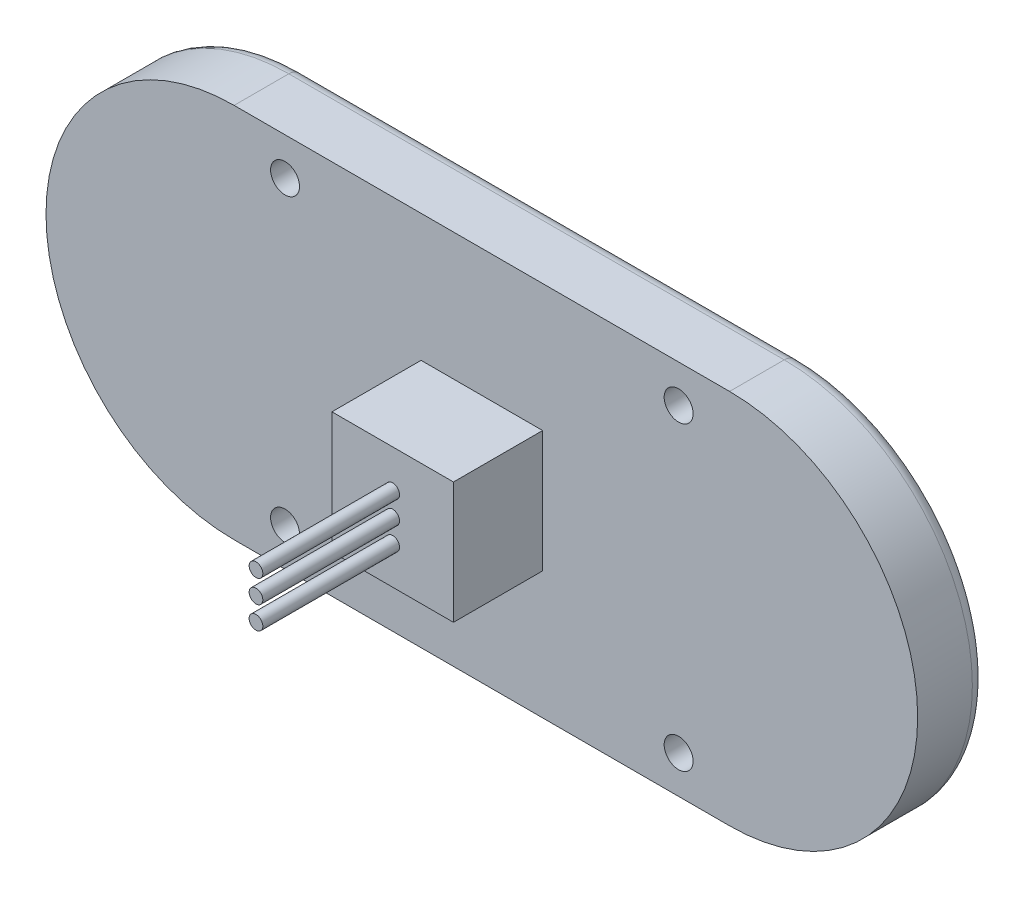
ISO-10303-21;
HEADER;
FILE_DESCRIPTION(('STEP AP214'),'2;1');
FILE_NAME('part.step','',(''),(''),'','','');
FILE_SCHEMA(('AUTOMOTIVE_DESIGN { 1 0 10303 214 1 1 1 1 }'));
ENDSEC;
DATA;
#1=APPLICATION_CONTEXT('core data for automotive mechanical design processes');
#2=APPLICATION_PROTOCOL_DEFINITION('international standard','automotive_design',2000,#1);
#3=PRODUCT_CONTEXT('',#1,'mechanical');
#4=PRODUCT('Part','Part','',(#3));
#5=PRODUCT_RELATED_PRODUCT_CATEGORY('part','',(#4));
#6=PRODUCT_DEFINITION_FORMATION('','',#4);
#7=PRODUCT_DEFINITION_CONTEXT('part definition',#1,'design');
#8=PRODUCT_DEFINITION('design','',#6,#7);
#9=PRODUCT_DEFINITION_SHAPE('','',#8);
#10=(LENGTH_UNIT() NAMED_UNIT(*) SI_UNIT(.MILLI.,.METRE.));
#11=(NAMED_UNIT(*) PLANE_ANGLE_UNIT() SI_UNIT($,.RADIAN.));
#12=(NAMED_UNIT(*) SI_UNIT($,.STERADIAN.) SOLID_ANGLE_UNIT());
#13=UNCERTAINTY_MEASURE_WITH_UNIT(LENGTH_MEASURE(1.E-05),#10,'distance_accuracy_value','');
#14=(GEOMETRIC_REPRESENTATION_CONTEXT(3) GLOBAL_UNCERTAINTY_ASSIGNED_CONTEXT((#13)) GLOBAL_UNIT_ASSIGNED_CONTEXT((#10,
#11,#12)) REPRESENTATION_CONTEXT('',''));
#15=CARTESIAN_POINT('',(0.,0.,0.));
#16=DIRECTION('',(0.,0.,1.));
#17=DIRECTION('',(1.,0.,0.));
#18=AXIS2_PLACEMENT_3D('',#15,#16,#17);
#19=CARTESIAN_POINT('',(54.3560000000004,-1.72171304990698E-13,-10.));
#20=DIRECTION('',(0.,0.,-1.));
#21=DIRECTION('',(-1.,0.,0.));
#22=AXIS2_PLACEMENT_3D('',#19,#20,#21);
#23=PLANE('',#22);
#24=DIRECTION('',(1.,0.,0.));
#25=VECTOR('',#24,1.);
#26=CARTESIAN_POINT('',(54.3560000000004,38.2749999999998,-10.));
#27=LINE('',#26,#25);
#28=CARTESIAN_POINT('',(-54.3559999999995,38.275,-10.));
#29=VERTEX_POINT('',#28);
#30=CARTESIAN_POINT('',(54.3560000000005,38.2749999999998,-10.));
#31=VERTEX_POINT('',#30);
#32=EDGE_CURVE('E278',#29,#31,#27,.T.);
#33=ORIENTED_EDGE('',*,*,#32,.T.);
#34=CARTESIAN_POINT('',(54.3560000000004,0.,-10.));
#35=DIRECTION('',(0.,0.,-1.));
#36=DIRECTION('',(-1.,0.,0.));
#37=AXIS2_PLACEMENT_3D('',#34,#35,#36);
#38=CIRCLE('',#37,38.275);
#39=CARTESIAN_POINT('',(54.3560000000004,-38.275,-10.));
#40=VERTEX_POINT('',#39);
#41=EDGE_CURVE('E291',#31,#40,#38,.T.);
#42=ORIENTED_EDGE('',*,*,#41,.T.);
#43=DIRECTION('',(-1.,0.,0.));
#44=VECTOR('',#43,1.);
#45=CARTESIAN_POINT('',(-54.3559999999996,-38.275,-10.));
#46=LINE('',#45,#44);
#47=CARTESIAN_POINT('',(-54.3559999999996,-38.275,-10.));
#48=VERTEX_POINT('',#47);
#49=EDGE_CURVE('E289',#40,#48,#46,.T.);
#50=ORIENTED_EDGE('',*,*,#49,.T.);
#51=CARTESIAN_POINT('',(-54.3559999999996,0.,-10.));
#52=DIRECTION('',(0.,0.,-1.));
#53=DIRECTION('',(-1.,0.,0.));
#54=AXIS2_PLACEMENT_3D('',#51,#52,#53);
#55=CIRCLE('',#54,38.275);
#56=EDGE_CURVE('E287',#48,#29,#55,.T.);
#57=ORIENTED_EDGE('',*,*,#56,.T.);
#58=EDGE_LOOP('',(#33,#42,#50,#57));
#59=FACE_BOUND('',#58,.T.);
#60=CARTESIAN_POINT('',(-43.18,-33.02,-10.));
#61=DIRECTION('',(0.,0.,-1.));
#62=DIRECTION('',(-1.,0.,0.));
#63=AXIS2_PLACEMENT_3D('',#60,#61,#62);
#64=CIRCLE('',#63,3.175);
#65=CARTESIAN_POINT('',(-46.355,-33.02,-10.));
#66=VERTEX_POINT('',#65);
#67=EDGE_CURVE('E183',#66,#66,#64,.T.);
#68=ORIENTED_EDGE('',*,*,#67,.F.);
#69=EDGE_LOOP('',(#68));
#70=FACE_BOUND('',#69,.T.);
#71=CARTESIAN_POINT('',(43.18,33.02,-10.));
#72=DIRECTION('',(0.,0.,-1.));
#73=DIRECTION('',(-1.,0.,0.));
#74=AXIS2_PLACEMENT_3D('',#71,#72,#73);
#75=CIRCLE('',#74,3.175);
#76=CARTESIAN_POINT('',(40.005,33.02,-10.));
#77=VERTEX_POINT('',#76);
#78=EDGE_CURVE('E190',#77,#77,#75,.T.);
#79=ORIENTED_EDGE('',*,*,#78,.F.);
#80=EDGE_LOOP('',(#79));
#81=FACE_BOUND('',#80,.T.);
#82=CARTESIAN_POINT('',(-43.18,33.02,-10.));
#83=DIRECTION('',(0.,0.,-1.));
#84=DIRECTION('',(-1.,0.,0.));
#85=AXIS2_PLACEMENT_3D('',#82,#83,#84);
#86=CIRCLE('',#85,3.175);
#87=CARTESIAN_POINT('',(-46.355,33.02,-10.));
#88=VERTEX_POINT('',#87);
#89=EDGE_CURVE('E187',#88,#88,#86,.T.);
#90=ORIENTED_EDGE('',*,*,#89,.F.);
#91=EDGE_LOOP('',(#90));
#92=FACE_BOUND('',#91,.T.);
#93=CARTESIAN_POINT('',(43.18,-33.02,-10.));
#94=DIRECTION('',(0.,0.,-1.));
#95=DIRECTION('',(-1.,0.,0.));
#96=AXIS2_PLACEMENT_3D('',#93,#94,#95);
#97=CIRCLE('',#96,3.175);
#98=CARTESIAN_POINT('',(40.005,-33.02,-10.));
#99=VERTEX_POINT('',#98);
#100=EDGE_CURVE('E180',#99,#99,#97,.T.);
#101=ORIENTED_EDGE('',*,*,#100,.F.);
#102=EDGE_LOOP('',(#101));
#103=FACE_BOUND('',#102,.T.);
#104=DIRECTION('',(-1.,0.,0.));
#105=VECTOR('',#104,1.);
#106=CARTESIAN_POINT('',(54.3560000000004,-25.0000000000001,-10.));
#107=LINE('',#106,#105);
#108=CARTESIAN_POINT('',(54.3560000000004,-25.0000000000001,-10.));
#109=VERTEX_POINT('',#108);
#110=CARTESIAN_POINT('',(-54.3559999999995,-25.,-10.));
#111=VERTEX_POINT('',#110);
#112=EDGE_CURVE('E149',#109,#111,#107,.T.);
#113=ORIENTED_EDGE('',*,*,#112,.F.);
#114=CARTESIAN_POINT('',(54.3560000000004,0.,-10.));
#115=DIRECTION('',(0.,0.,-1.));
#116=DIRECTION('',(-1.,0.,0.));
#117=AXIS2_PLACEMENT_3D('',#114,#115,#116);
#118=CIRCLE('',#117,25.);
#119=CARTESIAN_POINT('',(54.3560000000004,24.9999999999999,-10.));
#120=VERTEX_POINT('',#119);
#121=EDGE_CURVE('E150',#120,#109,#118,.T.);
#122=ORIENTED_EDGE('',*,*,#121,.F.);
#123=DIRECTION('',(1.,0.,0.));
#124=VECTOR('',#123,1.);
#125=CARTESIAN_POINT('',(54.3560000000004,24.9999999999999,-10.));
#126=LINE('',#125,#124);
#127=CARTESIAN_POINT('',(-54.3559999999995,24.9999999999999,-10.));
#128=VERTEX_POINT('',#127);
#129=EDGE_CURVE('E172',#128,#120,#126,.T.);
#130=ORIENTED_EDGE('',*,*,#129,.F.);
#131=CARTESIAN_POINT('',(-54.3559999999995,0.,-10.));
#132=DIRECTION('',(0.,0.,-1.));
#133=DIRECTION('',(-1.,0.,0.));
#134=AXIS2_PLACEMENT_3D('',#131,#132,#133);
#135=CIRCLE('',#134,25.);
#136=EDGE_CURVE('E152',#111,#128,#135,.T.);
#137=ORIENTED_EDGE('',*,*,#136,.F.);
#138=EDGE_LOOP('',(#113,#122,#130,#137));
#139=FACE_BOUND('',#138,.T.);
#140=ADVANCED_FACE('F34',(#59,#70,#81,#92,#103,#139),#23,.T.);
#141=CARTESIAN_POINT('',(0.,0.,5.));
#142=DIRECTION('',(0.,0.,1.));
#143=DIRECTION('',(1.,0.,0.));
#144=AXIS2_PLACEMENT_3D('',#141,#142,#143);
#145=PLANE('',#144);
#146=CARTESIAN_POINT('',(-43.18,-33.02,5.));
#147=DIRECTION('',(0.,0.,1.));
#148=DIRECTION('',(1.,0.,0.));
#149=AXIS2_PLACEMENT_3D('',#146,#147,#148);
#150=CIRCLE('',#149,3.175);
#151=CARTESIAN_POINT('',(-40.005,-33.02,5.));
#152=VERTEX_POINT('',#151);
#153=EDGE_CURVE('E244',#152,#152,#150,.T.);
#154=ORIENTED_EDGE('',*,*,#153,.F.);
#155=EDGE_LOOP('',(#154));
#156=FACE_BOUND('',#155,.T.);
#157=CARTESIAN_POINT('',(-43.18,33.02,5.));
#158=DIRECTION('',(0.,0.,1.));
#159=DIRECTION('',(1.,0.,0.));
#160=AXIS2_PLACEMENT_3D('',#157,#158,#159);
#161=CIRCLE('',#160,3.175);
#162=CARTESIAN_POINT('',(-40.005,33.02,5.));
#163=VERTEX_POINT('',#162);
#164=EDGE_CURVE('E251',#163,#163,#161,.T.);
#165=ORIENTED_EDGE('',*,*,#164,.F.);
#166=EDGE_LOOP('',(#165));
#167=FACE_BOUND('',#166,.T.);
#168=CARTESIAN_POINT('',(54.3560000000004,0.,5.));
#169=DIRECTION('',(0.,0.,1.));
#170=DIRECTION('',(1.,0.,0.));
#171=AXIS2_PLACEMENT_3D('',#168,#169,#170);
#172=CIRCLE('',#171,41.275);
#173=CARTESIAN_POINT('',(54.3560000000004,-41.275,5.));
#174=VERTEX_POINT('',#173);
#175=CARTESIAN_POINT('',(95.6310000000004,0.,5.));
#176=VERTEX_POINT('',#175);
#177=EDGE_CURVE('E269',#174,#176,#172,.T.);
#178=ORIENTED_EDGE('',*,*,#177,.T.);
#179=CARTESIAN_POINT('',(54.3560000000004,-1.72080882817482E-13,5.));
#180=DIRECTION('',(0.,0.,1.));
#181=DIRECTION('',(1.,0.,0.));
#182=AXIS2_PLACEMENT_3D('',#179,#180,#181);
#183=CIRCLE('',#182,41.275);
#184=CARTESIAN_POINT('',(54.3560000000004,41.2749999999998,5.));
#185=VERTEX_POINT('',#184);
#186=EDGE_CURVE('E271',#176,#185,#183,.T.);
#187=ORIENTED_EDGE('',*,*,#186,.T.);
#188=DIRECTION('',(-1.,0.,0.));
#189=VECTOR('',#188,1.);
#190=CARTESIAN_POINT('',(-95.6309999999996,41.275,5.));
#191=LINE('',#190,#189);
#192=CARTESIAN_POINT('',(-54.3559999999995,41.275,5.));
#193=VERTEX_POINT('',#192);
#194=EDGE_CURVE('E254',#185,#193,#191,.T.);
#195=ORIENTED_EDGE('',*,*,#194,.T.);
#196=CARTESIAN_POINT('',(-54.3559999999996,0.,5.));
#197=DIRECTION('',(0.,0.,1.));
#198=DIRECTION('',(1.,0.,0.));
#199=AXIS2_PLACEMENT_3D('',#196,#197,#198);
#200=CIRCLE('',#199,41.275);
#201=CARTESIAN_POINT('',(-95.6309999999996,0.,5.));
#202=VERTEX_POINT('',#201);
#203=EDGE_CURVE('E267',#193,#202,#200,.T.);
#204=ORIENTED_EDGE('',*,*,#203,.T.);
#205=CARTESIAN_POINT('',(-54.3559999999996,0.,5.));
#206=DIRECTION('',(0.,0.,1.));
#207=DIRECTION('',(1.,0.,0.));
#208=AXIS2_PLACEMENT_3D('',#205,#206,#207);
#209=CIRCLE('',#208,41.275);
#210=CARTESIAN_POINT('',(-54.3559999999996,-41.275,5.));
#211=VERTEX_POINT('',#210);
#212=EDGE_CURVE('E265',#202,#211,#209,.T.);
#213=ORIENTED_EDGE('',*,*,#212,.T.);
#214=DIRECTION('',(1.,0.,0.));
#215=VECTOR('',#214,1.);
#216=CARTESIAN_POINT('',(-95.6309999999996,-41.275,5.));
#217=LINE('',#216,#215);
#218=EDGE_CURVE('E257',#211,#174,#217,.T.);
#219=ORIENTED_EDGE('',*,*,#218,.T.);
#220=EDGE_LOOP('',(#178,#187,#195,#204,#213,#219));
#221=FACE_BOUND('',#220,.T.);
#222=CARTESIAN_POINT('',(43.18,33.02,5.));
#223=DIRECTION('',(0.,0.,1.));
#224=DIRECTION('',(1.,0.,0.));
#225=AXIS2_PLACEMENT_3D('',#222,#223,#224);
#226=CIRCLE('',#225,3.175);
#227=CARTESIAN_POINT('',(46.355,33.02,5.));
#228=VERTEX_POINT('',#227);
#229=EDGE_CURVE('E248',#228,#228,#226,.T.);
#230=ORIENTED_EDGE('',*,*,#229,.F.);
#231=EDGE_LOOP('',(#230));
#232=FACE_BOUND('',#231,.T.);
#233=CARTESIAN_POINT('',(43.18,-33.02,5.));
#234=DIRECTION('',(0.,0.,1.));
#235=DIRECTION('',(1.,0.,0.));
#236=AXIS2_PLACEMENT_3D('',#233,#234,#235);
#237=CIRCLE('',#236,3.175);
#238=CARTESIAN_POINT('',(46.355,-33.02,5.));
#239=VERTEX_POINT('',#238);
#240=EDGE_CURVE('E241',#239,#239,#237,.T.);
#241=ORIENTED_EDGE('',*,*,#240,.F.);
#242=EDGE_LOOP('',(#241));
#243=FACE_BOUND('',#242,.T.);
#244=DIRECTION('',(-1.,0.,0.));
#245=VECTOR('',#244,1.);
#246=CARTESIAN_POINT('',(-13.335,13.335,5.));
#247=LINE('',#246,#245);
#248=CARTESIAN_POINT('',(13.335,13.335,5.));
#249=VERTEX_POINT('',#248);
#250=CARTESIAN_POINT('',(-13.335,13.335,5.));
#251=VERTEX_POINT('',#250);
#252=EDGE_CURVE('E225',#249,#251,#247,.T.);
#253=ORIENTED_EDGE('',*,*,#252,.F.);
#254=DIRECTION('',(0.,1.,0.));
#255=VECTOR('',#254,1.);
#256=CARTESIAN_POINT('',(13.335,13.335,5.));
#257=LINE('',#256,#255);
#258=CARTESIAN_POINT('',(13.335,-13.335,5.));
#259=VERTEX_POINT('',#258);
#260=EDGE_CURVE('E209',#259,#249,#257,.T.);
#261=ORIENTED_EDGE('',*,*,#260,.F.);
#262=DIRECTION('',(1.,0.,0.));
#263=VECTOR('',#262,1.);
#264=CARTESIAN_POINT('',(-13.335,-13.335,5.));
#265=LINE('',#264,#263);
#266=CARTESIAN_POINT('',(-13.335,-13.335,5.));
#267=VERTEX_POINT('',#266);
#268=EDGE_CURVE('E216',#267,#259,#265,.T.);
#269=ORIENTED_EDGE('',*,*,#268,.F.);
#270=DIRECTION('',(0.,-1.,0.));
#271=VECTOR('',#270,1.);
#272=CARTESIAN_POINT('',(-13.335,13.335,5.));
#273=LINE('',#272,#271);
#274=EDGE_CURVE('E227',#251,#267,#273,.T.);
#275=ORIENTED_EDGE('',*,*,#274,.F.);
#276=EDGE_LOOP('',(#253,#261,#269,#275));
#277=FACE_BOUND('',#276,.T.);
#278=ADVANCED_FACE('F325',(#156,#167,#221,#232,#243,#277),#145,.T.);
#279=CARTESIAN_POINT('',(-95.6309999999996,41.275,5.));
#280=DIRECTION('',(0.,-1.,0.));
#281=DIRECTION('',(1.,0.,0.));
#282=AXIS2_PLACEMENT_3D('',#279,#280,#281);
#283=PLANE('',#282);
#284=DIRECTION('',(0.,0.,-1.));
#285=VECTOR('',#284,1.);
#286=CARTESIAN_POINT('',(54.3560000000005,41.2749999999998,5.));
#287=LINE('',#286,#285);
#288=CARTESIAN_POINT('',(54.3560000000005,41.2749999999998,-7.));
#289=VERTEX_POINT('',#288);
#290=EDGE_CURVE('E260',#185,#289,#287,.T.);
#291=ORIENTED_EDGE('',*,*,#290,.T.);
#292=DIRECTION('',(1.,0.,0.));
#293=VECTOR('',#292,1.);
#294=CARTESIAN_POINT('',(-54.3559999999995,41.275,-7.));
#295=LINE('',#294,#293);
#296=CARTESIAN_POINT('',(-54.3559999999995,41.275,-7.));
#297=VERTEX_POINT('',#296);
#298=EDGE_CURVE('E301',#289,#297,#295,.F.);
#299=ORIENTED_EDGE('',*,*,#298,.T.);
#300=DIRECTION('',(0.,0.,-1.));
#301=VECTOR('',#300,1.);
#302=CARTESIAN_POINT('',(-54.3559999999995,41.275,5.));
#303=LINE('',#302,#301);
#304=EDGE_CURVE('E263',#297,#193,#303,.F.);
#305=ORIENTED_EDGE('',*,*,#304,.T.);
#306=ORIENTED_EDGE('',*,*,#194,.F.);
#307=EDGE_LOOP('',(#291,#299,#305,#306));
#308=FACE_BOUND('',#307,.T.);
#309=ADVANCED_FACE('F330',(#308),#283,.F.);
#310=CARTESIAN_POINT('',(-95.6309999999996,-41.275,5.));
#311=DIRECTION('',(0.,1.,0.));
#312=DIRECTION('',(0.,0.,1.));
#313=AXIS2_PLACEMENT_3D('',#310,#311,#312);
#314=PLANE('',#313);
#315=DIRECTION('',(0.,0.,-1.));
#316=VECTOR('',#315,1.);
#317=CARTESIAN_POINT('',(-54.3559999999996,-41.275,5.));
#318=LINE('',#317,#316);
#319=CARTESIAN_POINT('',(-54.3559999999996,-41.275,-7.));
#320=VERTEX_POINT('',#319);
#321=EDGE_CURVE('E273',#211,#320,#318,.T.);
#322=ORIENTED_EDGE('',*,*,#321,.T.);
#323=DIRECTION('',(-1.,0.,0.));
#324=VECTOR('',#323,1.);
#325=CARTESIAN_POINT('',(54.3560000000004,-41.275,-7.));
#326=LINE('',#325,#324);
#327=CARTESIAN_POINT('',(54.3560000000004,-41.275,-7.));
#328=VERTEX_POINT('',#327);
#329=EDGE_CURVE('E297',#320,#328,#326,.F.);
#330=ORIENTED_EDGE('',*,*,#329,.T.);
#331=DIRECTION('',(0.,0.,-1.));
#332=VECTOR('',#331,1.);
#333=CARTESIAN_POINT('',(54.3560000000004,-41.275,5.));
#334=LINE('',#333,#332);
#335=EDGE_CURVE('E276',#328,#174,#334,.F.);
#336=ORIENTED_EDGE('',*,*,#335,.T.);
#337=ORIENTED_EDGE('',*,*,#218,.F.);
#338=EDGE_LOOP('',(#322,#330,#336,#337));
#339=FACE_BOUND('',#338,.T.);
#340=ADVANCED_FACE('F396',(#339),#314,.F.);
#341=CARTESIAN_POINT('',(-43.18,33.02,5.));
#342=DIRECTION('',(0.,0.,-1.));
#343=DIRECTION('',(-1.,0.,0.));
#344=AXIS2_PLACEMENT_3D('',#341,#342,#343);
#345=CYLINDRICAL_SURFACE('',#344,3.175);
#346=ORIENTED_EDGE('',*,*,#164,.T.);
#347=EDGE_LOOP('',(#346));
#348=FACE_BOUND('',#347,.T.);
#349=ORIENTED_EDGE('',*,*,#89,.T.);
#350=EDGE_LOOP('',(#349));
#351=FACE_BOUND('',#350,.T.);
#352=ADVANCED_FACE('F393',(#348,#351),#345,.F.);
#353=CARTESIAN_POINT('',(43.18,33.02,5.));
#354=DIRECTION('',(0.,0.,-1.));
#355=DIRECTION('',(-1.,0.,0.));
#356=AXIS2_PLACEMENT_3D('',#353,#354,#355);
#357=CYLINDRICAL_SURFACE('',#356,3.175);
#358=ORIENTED_EDGE('',*,*,#229,.T.);
#359=EDGE_LOOP('',(#358));
#360=FACE_BOUND('',#359,.T.);
#361=ORIENTED_EDGE('',*,*,#78,.T.);
#362=EDGE_LOOP('',(#361));
#363=FACE_BOUND('',#362,.T.);
#364=ADVANCED_FACE('F389',(#360,#363),#357,.F.);
#365=CARTESIAN_POINT('',(-43.18,-33.02,5.));
#366=DIRECTION('',(0.,0.,-1.));
#367=DIRECTION('',(-1.,0.,0.));
#368=AXIS2_PLACEMENT_3D('',#365,#366,#367);
#369=CYLINDRICAL_SURFACE('',#368,3.175);
#370=ORIENTED_EDGE('',*,*,#153,.T.);
#371=EDGE_LOOP('',(#370));
#372=FACE_BOUND('',#371,.T.);
#373=ORIENTED_EDGE('',*,*,#67,.T.);
#374=EDGE_LOOP('',(#373));
#375=FACE_BOUND('',#374,.T.);
#376=ADVANCED_FACE('F385',(#372,#375),#369,.F.);
#377=CARTESIAN_POINT('',(43.18,-33.02,5.));
#378=DIRECTION('',(0.,0.,-1.));
#379=DIRECTION('',(-1.,0.,0.));
#380=AXIS2_PLACEMENT_3D('',#377,#378,#379);
#381=CYLINDRICAL_SURFACE('',#380,3.175);
#382=ORIENTED_EDGE('',*,*,#240,.T.);
#383=EDGE_LOOP('',(#382));
#384=FACE_BOUND('',#383,.T.);
#385=ORIENTED_EDGE('',*,*,#100,.T.);
#386=EDGE_LOOP('',(#385));
#387=FACE_BOUND('',#386,.T.);
#388=ADVANCED_FACE('F381',(#384,#387),#381,.F.);
#389=CARTESIAN_POINT('',(-54.3559999999996,0.,5.));
#390=DIRECTION('',(0.,0.,-1.));
#391=DIRECTION('',(-1.,0.,0.));
#392=AXIS2_PLACEMENT_3D('',#389,#390,#391);
#393=CYLINDRICAL_SURFACE('',#392,41.275);
#394=ORIENTED_EDGE('',*,*,#304,.F.);
#395=CARTESIAN_POINT('',(-54.3559999999996,0.,-7.));
#396=DIRECTION('',(0.,0.,-1.));
#397=DIRECTION('',(-1.,0.,0.));
#398=AXIS2_PLACEMENT_3D('',#395,#396,#397);
#399=CIRCLE('',#398,41.275);
#400=EDGE_CURVE('E299',#297,#320,#399,.F.);
#401=ORIENTED_EDGE('',*,*,#400,.T.);
#402=ORIENTED_EDGE('',*,*,#321,.F.);
#403=ORIENTED_EDGE('',*,*,#212,.F.);
#404=DIRECTION('',(0.,0.,-1.));
#405=VECTOR('',#404,1.);
#406=CARTESIAN_POINT('',(-95.6309999999996,0.,5.));
#407=LINE('',#406,#405);
#408=CARTESIAN_POINT('',(-95.6309999999996,0.,0.));
#409=VERTEX_POINT('',#408);
#410=EDGE_CURVE('E245',#409,#202,#407,.F.);
#411=ORIENTED_EDGE('',*,*,#410,.F.);
#412=ORIENTED_EDGE('',*,*,#410,.T.);
#413=ORIENTED_EDGE('',*,*,#203,.F.);
#414=EDGE_LOOP('',(#394,#401,#402,#403,#411,#412,#413));
#415=FACE_BOUND('',#414,.T.);
#416=ADVANCED_FACE('F384',(#415),#393,.T.);
#417=CARTESIAN_POINT('',(54.3560000000004,0.,5.));
#418=DIRECTION('',(0.,0.,-1.));
#419=DIRECTION('',(-1.,0.,0.));
#420=AXIS2_PLACEMENT_3D('',#417,#418,#419);
#421=CYLINDRICAL_SURFACE('',#420,41.275);
#422=ORIENTED_EDGE('',*,*,#335,.F.);
#423=CARTESIAN_POINT('',(54.3560000000004,0.,-7.));
#424=DIRECTION('',(0.,0.,-1.));
#425=DIRECTION('',(-1.,0.,0.));
#426=AXIS2_PLACEMENT_3D('',#423,#424,#425);
#427=CIRCLE('',#426,41.275);
#428=EDGE_CURVE('E294',#328,#289,#427,.F.);
#429=ORIENTED_EDGE('',*,*,#428,.T.);
#430=ORIENTED_EDGE('',*,*,#290,.F.);
#431=ORIENTED_EDGE('',*,*,#186,.F.);
#432=DIRECTION('',(0.,0.,-1.));
#433=VECTOR('',#432,1.);
#434=CARTESIAN_POINT('',(95.6310000000004,0.,5.));
#435=LINE('',#434,#433);
#436=CARTESIAN_POINT('',(95.6310000000004,0.,0.));
#437=VERTEX_POINT('',#436);
#438=EDGE_CURVE('E240',#176,#437,#435,.T.);
#439=ORIENTED_EDGE('',*,*,#438,.T.);
#440=ORIENTED_EDGE('',*,*,#438,.F.);
#441=ORIENTED_EDGE('',*,*,#177,.F.);
#442=EDGE_LOOP('',(#422,#429,#430,#431,#439,#440,#441));
#443=FACE_BOUND('',#442,.T.);
#444=ADVANCED_FACE('F379',(#443),#421,.T.);
#445=CARTESIAN_POINT('',(13.335,13.335,24.558));
#446=DIRECTION('',(-1.,0.,0.));
#447=DIRECTION('',(0.,-1.,0.));
#448=AXIS2_PLACEMENT_3D('',#445,#446,#447);
#449=PLANE('',#448);
#450=ORIENTED_EDGE('',*,*,#260,.T.);
#451=DIRECTION('',(0.,0.,-1.));
#452=VECTOR('',#451,1.);
#453=CARTESIAN_POINT('',(13.335,13.335,24.558));
#454=LINE('',#453,#452);
#455=CARTESIAN_POINT('',(13.335,13.335,24.558));
#456=VERTEX_POINT('',#455);
#457=EDGE_CURVE('E238',#456,#249,#454,.T.);
#458=ORIENTED_EDGE('',*,*,#457,.F.);
#459=DIRECTION('',(0.,1.,0.));
#460=VECTOR('',#459,1.);
#461=CARTESIAN_POINT('',(13.335,13.335,24.558));
#462=LINE('',#461,#460);
#463=CARTESIAN_POINT('',(13.335,-13.335,24.558));
#464=VERTEX_POINT('',#463);
#465=EDGE_CURVE('E212',#464,#456,#462,.T.);
#466=ORIENTED_EDGE('',*,*,#465,.F.);
#467=DIRECTION('',(0.,0.,-1.));
#468=VECTOR('',#467,1.);
#469=CARTESIAN_POINT('',(13.335,-13.335,24.558));
#470=LINE('',#469,#468);
#471=EDGE_CURVE('E222',#464,#259,#470,.T.);
#472=ORIENTED_EDGE('',*,*,#471,.T.);
#473=EDGE_LOOP('',(#450,#458,#466,#472));
#474=FACE_BOUND('',#473,.T.);
#475=ADVANCED_FACE('F375',(#474),#449,.F.);
#476=CARTESIAN_POINT('',(-13.335,13.335,24.558));
#477=DIRECTION('',(0.,-1.,0.));
#478=DIRECTION('',(0.,0.,-1.));
#479=AXIS2_PLACEMENT_3D('',#476,#477,#478);
#480=PLANE('',#479);
#481=ORIENTED_EDGE('',*,*,#252,.T.);
#482=DIRECTION('',(0.,0.,-1.));
#483=VECTOR('',#482,1.);
#484=CARTESIAN_POINT('',(-13.335,13.335,24.558));
#485=LINE('',#484,#483);
#486=CARTESIAN_POINT('',(-13.335,13.335,24.558));
#487=VERTEX_POINT('',#486);
#488=EDGE_CURVE('E235',#487,#251,#485,.T.);
#489=ORIENTED_EDGE('',*,*,#488,.F.);
#490=DIRECTION('',(-1.,0.,0.));
#491=VECTOR('',#490,1.);
#492=CARTESIAN_POINT('',(-13.335,13.335,24.558));
#493=LINE('',#492,#491);
#494=EDGE_CURVE('E215',#456,#487,#493,.T.);
#495=ORIENTED_EDGE('',*,*,#494,.F.);
#496=ORIENTED_EDGE('',*,*,#457,.T.);
#497=EDGE_LOOP('',(#481,#489,#495,#496));
#498=FACE_BOUND('',#497,.T.);
#499=ADVANCED_FACE('F371',(#498),#480,.F.);
#500=CARTESIAN_POINT('',(-13.335,13.335,24.558));
#501=DIRECTION('',(1.,0.,0.));
#502=DIRECTION('',(0.,1.,0.));
#503=AXIS2_PLACEMENT_3D('',#500,#501,#502);
#504=PLANE('',#503);
#505=ORIENTED_EDGE('',*,*,#274,.T.);
#506=DIRECTION('',(0.,0.,-1.));
#507=VECTOR('',#506,1.);
#508=CARTESIAN_POINT('',(-13.335,-13.335,24.558));
#509=LINE('',#508,#507);
#510=CARTESIAN_POINT('',(-13.335,-13.335,24.558));
#511=VERTEX_POINT('',#510);
#512=EDGE_CURVE('E233',#511,#267,#509,.T.);
#513=ORIENTED_EDGE('',*,*,#512,.F.);
#514=DIRECTION('',(0.,-1.,0.));
#515=VECTOR('',#514,1.);
#516=CARTESIAN_POINT('',(-13.335,13.335,24.558));
#517=LINE('',#516,#515);
#518=EDGE_CURVE('E218',#487,#511,#517,.T.);
#519=ORIENTED_EDGE('',*,*,#518,.F.);
#520=ORIENTED_EDGE('',*,*,#488,.T.);
#521=EDGE_LOOP('',(#505,#513,#519,#520));
#522=FACE_BOUND('',#521,.T.);
#523=ADVANCED_FACE('F367',(#522),#504,.F.);
#524=CARTESIAN_POINT('',(-13.335,-13.335,24.558));
#525=DIRECTION('',(0.,1.,0.));
#526=DIRECTION('',(0.,0.,1.));
#527=AXIS2_PLACEMENT_3D('',#524,#525,#526);
#528=PLANE('',#527);
#529=ORIENTED_EDGE('',*,*,#268,.T.);
#530=ORIENTED_EDGE('',*,*,#471,.F.);
#531=DIRECTION('',(1.,0.,0.));
#532=VECTOR('',#531,1.);
#533=CARTESIAN_POINT('',(-13.335,-13.335,24.558));
#534=LINE('',#533,#532);
#535=EDGE_CURVE('E220',#511,#464,#534,.T.);
#536=ORIENTED_EDGE('',*,*,#535,.F.);
#537=ORIENTED_EDGE('',*,*,#512,.T.);
#538=EDGE_LOOP('',(#529,#530,#536,#537));
#539=FACE_BOUND('',#538,.T.);
#540=ADVANCED_FACE('F363',(#539),#528,.F.);
#541=CARTESIAN_POINT('',(0.,0.,24.558));
#542=DIRECTION('',(0.,0.,1.));
#543=DIRECTION('',(1.,0.,0.));
#544=AXIS2_PLACEMENT_3D('',#541,#542,#543);
#545=PLANE('',#544);
#546=CARTESIAN_POINT('',(0.,-5.,24.558));
#547=DIRECTION('',(0.,0.,1.));
#548=DIRECTION('',(1.,0.,0.));
#549=AXIS2_PLACEMENT_3D('',#546,#547,#548);
#550=CIRCLE('',#549,1.5);
#551=CARTESIAN_POINT('',(1.5,-5.,24.558));
#552=VERTEX_POINT('',#551);
#553=EDGE_CURVE('E193',#552,#552,#550,.T.);
#554=ORIENTED_EDGE('',*,*,#553,.F.);
#555=EDGE_LOOP('',(#554));
#556=FACE_BOUND('',#555,.T.);
#557=CARTESIAN_POINT('',(0.,0.,24.558));
#558=DIRECTION('',(0.,0.,1.));
#559=DIRECTION('',(1.,0.,0.));
#560=AXIS2_PLACEMENT_3D('',#557,#558,#559);
#561=CIRCLE('',#560,1.5);
#562=CARTESIAN_POINT('',(1.5,0.,24.558));
#563=VERTEX_POINT('',#562);
#564=EDGE_CURVE('E197',#563,#563,#561,.T.);
#565=ORIENTED_EDGE('',*,*,#564,.F.);
#566=EDGE_LOOP('',(#565));
#567=FACE_BOUND('',#566,.T.);
#568=CARTESIAN_POINT('',(0.,5.,24.558));
#569=DIRECTION('',(0.,0.,1.));
#570=DIRECTION('',(1.,0.,0.));
#571=AXIS2_PLACEMENT_3D('',#568,#569,#570);
#572=CIRCLE('',#571,1.5);
#573=CARTESIAN_POINT('',(1.5,5.,24.558));
#574=VERTEX_POINT('',#573);
#575=EDGE_CURVE('E203',#574,#574,#572,.T.);
#576=ORIENTED_EDGE('',*,*,#575,.F.);
#577=EDGE_LOOP('',(#576));
#578=FACE_BOUND('',#577,.T.);
#579=ORIENTED_EDGE('',*,*,#465,.T.);
#580=ORIENTED_EDGE('',*,*,#494,.T.);
#581=ORIENTED_EDGE('',*,*,#518,.T.);
#582=ORIENTED_EDGE('',*,*,#535,.T.);
#583=EDGE_LOOP('',(#579,#580,#581,#582));
#584=FACE_BOUND('',#583,.T.);
#585=ADVANCED_FACE('F359',(#556,#567,#578,#584),#545,.T.);
#586=CARTESIAN_POINT('',(0.,5.,54.558));
#587=DIRECTION('',(0.,0.,-1.));
#588=DIRECTION('',(-1.,0.,0.));
#589=AXIS2_PLACEMENT_3D('',#586,#587,#588);
#590=CYLINDRICAL_SURFACE('',#589,1.5);
#591=CARTESIAN_POINT('',(0.,5.,54.558));
#592=DIRECTION('',(0.,0.,1.));
#593=DIRECTION('',(1.,0.,0.));
#594=AXIS2_PLACEMENT_3D('',#591,#592,#593);
#595=CIRCLE('',#594,1.5);
#596=CARTESIAN_POINT('',(1.5,5.,54.558));
#597=VERTEX_POINT('',#596);
#598=EDGE_CURVE('E206',#597,#597,#595,.T.);
#599=ORIENTED_EDGE('',*,*,#598,.F.);
#600=EDGE_LOOP('',(#599));
#601=FACE_BOUND('',#600,.T.);
#602=ORIENTED_EDGE('',*,*,#575,.T.);
#603=EDGE_LOOP('',(#602));
#604=FACE_BOUND('',#603,.T.);
#605=ADVANCED_FACE('F355',(#601,#604),#590,.T.);
#606=CARTESIAN_POINT('',(0.,5.,54.558));
#607=DIRECTION('',(0.,0.,1.));
#608=DIRECTION('',(1.,0.,0.));
#609=AXIS2_PLACEMENT_3D('',#606,#607,#608);
#610=PLANE('',#609);
#611=ORIENTED_EDGE('',*,*,#598,.T.);
#612=EDGE_LOOP('',(#611));
#613=FACE_BOUND('',#612,.T.);
#614=ADVANCED_FACE('F351',(#613),#610,.T.);
#615=CARTESIAN_POINT('',(0.,0.,54.558));
#616=DIRECTION('',(0.,0.,-1.));
#617=DIRECTION('',(-1.,0.,0.));
#618=AXIS2_PLACEMENT_3D('',#615,#616,#617);
#619=CYLINDRICAL_SURFACE('',#618,1.5);
#620=CARTESIAN_POINT('',(0.,0.,54.558));
#621=DIRECTION('',(0.,0.,1.));
#622=DIRECTION('',(1.,0.,0.));
#623=AXIS2_PLACEMENT_3D('',#620,#621,#622);
#624=CIRCLE('',#623,1.5);
#625=CARTESIAN_POINT('',(1.5,0.,54.558));
#626=VERTEX_POINT('',#625);
#627=EDGE_CURVE('E200',#626,#626,#624,.T.);
#628=ORIENTED_EDGE('',*,*,#627,.F.);
#629=EDGE_LOOP('',(#628));
#630=FACE_BOUND('',#629,.T.);
#631=ORIENTED_EDGE('',*,*,#564,.T.);
#632=EDGE_LOOP('',(#631));
#633=FACE_BOUND('',#632,.T.);
#634=ADVANCED_FACE('F347',(#630,#633),#619,.T.);
#635=CARTESIAN_POINT('',(0.,0.,54.558));
#636=DIRECTION('',(0.,0.,1.));
#637=DIRECTION('',(1.,0.,0.));
#638=AXIS2_PLACEMENT_3D('',#635,#636,#637);
#639=PLANE('',#638);
#640=ORIENTED_EDGE('',*,*,#627,.T.);
#641=EDGE_LOOP('',(#640));
#642=FACE_BOUND('',#641,.T.);
#643=ADVANCED_FACE('F343',(#642),#639,.T.);
#644=CARTESIAN_POINT('',(0.,-5.,54.558));
#645=DIRECTION('',(0.,0.,-1.));
#646=DIRECTION('',(-1.,0.,0.));
#647=AXIS2_PLACEMENT_3D('',#644,#645,#646);
#648=CYLINDRICAL_SURFACE('',#647,1.5);
#649=CARTESIAN_POINT('',(0.,-5.,54.558));
#650=DIRECTION('',(0.,0.,1.));
#651=DIRECTION('',(1.,0.,0.));
#652=AXIS2_PLACEMENT_3D('',#649,#650,#651);
#653=CIRCLE('',#652,1.5);
#654=CARTESIAN_POINT('',(1.5,-5.,54.558));
#655=VERTEX_POINT('',#654);
#656=EDGE_CURVE('E194',#655,#655,#653,.T.);
#657=ORIENTED_EDGE('',*,*,#656,.F.);
#658=EDGE_LOOP('',(#657));
#659=FACE_BOUND('',#658,.T.);
#660=ORIENTED_EDGE('',*,*,#553,.T.);
#661=EDGE_LOOP('',(#660));
#662=FACE_BOUND('',#661,.T.);
#663=ADVANCED_FACE('F339',(#659,#662),#648,.T.);
#664=CARTESIAN_POINT('',(0.,-5.,54.558));
#665=DIRECTION('',(0.,0.,1.));
#666=DIRECTION('',(1.,0.,0.));
#667=AXIS2_PLACEMENT_3D('',#664,#665,#666);
#668=PLANE('',#667);
#669=ORIENTED_EDGE('',*,*,#656,.T.);
#670=EDGE_LOOP('',(#669));
#671=FACE_BOUND('',#670,.T.);
#672=ADVANCED_FACE('F335',(#671),#668,.T.);
#673=CARTESIAN_POINT('',(-54.3559999999996,0.,-7.));
#674=DIRECTION('',(0.,0.,-1.));
#675=DIRECTION('',(-1.,0.,0.));
#676=AXIS2_PLACEMENT_3D('',#673,#674,#675);
#677=TOROIDAL_SURFACE('',#676,38.275,3.);
#678=CARTESIAN_POINT('',(-54.3559999999996,-38.275,-7.));
#679=DIRECTION('',(1.,0.,0.));
#680=DIRECTION('',(0.,0.,-1.));
#681=AXIS2_PLACEMENT_3D('',#678,#679,#680);
#682=CIRCLE('',#681,3.);
#683=EDGE_CURVE('E306',#320,#48,#682,.T.);
#684=ORIENTED_EDGE('',*,*,#683,.F.);
#685=ORIENTED_EDGE('',*,*,#400,.F.);
#686=CARTESIAN_POINT('',(-54.3559999999995,38.275,-7.));
#687=DIRECTION('',(1.,0.,0.));
#688=DIRECTION('',(0.,1.,0.));
#689=AXIS2_PLACEMENT_3D('',#686,#687,#688);
#690=CIRCLE('',#689,3.);
#691=EDGE_CURVE('E184',#29,#297,#690,.T.);
#692=ORIENTED_EDGE('',*,*,#691,.F.);
#693=ORIENTED_EDGE('',*,*,#56,.F.);
#694=EDGE_LOOP('',(#684,#685,#692,#693));
#695=FACE_BOUND('',#694,.T.);
#696=ADVANCED_FACE('F338',(#695),#677,.T.);
#697=CARTESIAN_POINT('',(54.3560000000005,38.2749999999998,-7.));
#698=DIRECTION('',(-1.,0.,0.));
#699=DIRECTION('',(0.,-1.,0.));
#700=AXIS2_PLACEMENT_3D('',#697,#698,#699);
#701=CYLINDRICAL_SURFACE('',#700,3.);
#702=ORIENTED_EDGE('',*,*,#691,.T.);
#703=ORIENTED_EDGE('',*,*,#298,.F.);
#704=CARTESIAN_POINT('',(54.3560000000005,38.2749999999998,-7.));
#705=DIRECTION('',(1.,0.,0.));
#706=DIRECTION('',(0.,1.,0.));
#707=AXIS2_PLACEMENT_3D('',#704,#705,#706);
#708=CIRCLE('',#707,3.);
#709=EDGE_CURVE('E304',#31,#289,#708,.T.);
#710=ORIENTED_EDGE('',*,*,#709,.F.);
#711=ORIENTED_EDGE('',*,*,#32,.F.);
#712=EDGE_LOOP('',(#702,#703,#710,#711));
#713=FACE_BOUND('',#712,.T.);
#714=ADVANCED_FACE('F413',(#713),#701,.T.);
#715=CARTESIAN_POINT('',(54.3560000000004,-38.275,-7.));
#716=DIRECTION('',(1.,0.,0.));
#717=DIRECTION('',(0.,0.,-1.));
#718=AXIS2_PLACEMENT_3D('',#715,#716,#717);
#719=CYLINDRICAL_SURFACE('',#718,3.);
#720=ORIENTED_EDGE('',*,*,#683,.T.);
#721=ORIENTED_EDGE('',*,*,#49,.F.);
#722=CARTESIAN_POINT('',(54.3560000000004,-38.275,-7.));
#723=DIRECTION('',(1.,0.,0.));
#724=DIRECTION('',(0.,0.,-1.));
#725=AXIS2_PLACEMENT_3D('',#722,#723,#724);
#726=CIRCLE('',#725,3.);
#727=EDGE_CURVE('E177',#328,#40,#726,.T.);
#728=ORIENTED_EDGE('',*,*,#727,.F.);
#729=ORIENTED_EDGE('',*,*,#329,.F.);
#730=EDGE_LOOP('',(#720,#721,#728,#729));
#731=FACE_BOUND('',#730,.T.);
#732=ADVANCED_FACE('F320',(#731),#719,.T.);
#733=CARTESIAN_POINT('',(54.3560000000004,0.,-7.));
#734=DIRECTION('',(0.,0.,-1.));
#735=DIRECTION('',(-1.,0.,0.));
#736=AXIS2_PLACEMENT_3D('',#733,#734,#735);
#737=TOROIDAL_SURFACE('',#736,38.275,3.);
#738=ORIENTED_EDGE('',*,*,#709,.T.);
#739=ORIENTED_EDGE('',*,*,#428,.F.);
#740=ORIENTED_EDGE('',*,*,#727,.T.);
#741=ORIENTED_EDGE('',*,*,#41,.F.);
#742=EDGE_LOOP('',(#738,#739,#740,#741));
#743=FACE_BOUND('',#742,.T.);
#744=ADVANCED_FACE('F314',(#743),#737,.T.);
#745=CARTESIAN_POINT('',(54.3560000000004,0.,-20.));
#746=DIRECTION('',(0.,0.,-1.));
#747=DIRECTION('',(-1.,0.,0.));
#748=AXIS2_PLACEMENT_3D('',#745,#746,#747);
#749=PLANE('',#748);
#750=DIRECTION('',(1.,0.,0.));
#751=VECTOR('',#750,1.);
#752=CARTESIAN_POINT('',(54.3560000000004,14.9999999999999,-20.));
#753=LINE('',#752,#751);
#754=CARTESIAN_POINT('',(-54.3559999999995,14.9999999999999,-20.));
#755=VERTEX_POINT('',#754);
#756=CARTESIAN_POINT('',(54.3560000000004,14.9999999999999,-20.));
#757=VERTEX_POINT('',#756);
#758=EDGE_CURVE('E173',#755,#757,#753,.T.);
#759=ORIENTED_EDGE('',*,*,#758,.T.);
#760=CARTESIAN_POINT('',(54.3560000000004,0.,-20.));
#761=DIRECTION('',(0.,0.,-1.));
#762=DIRECTION('',(-1.,0.,0.));
#763=AXIS2_PLACEMENT_3D('',#760,#761,#762);
#764=CIRCLE('',#763,15.);
#765=CARTESIAN_POINT('',(54.3560000000004,-15.0000000000001,-20.));
#766=VERTEX_POINT('',#765);
#767=EDGE_CURVE('E11',#757,#766,#764,.T.);
#768=ORIENTED_EDGE('',*,*,#767,.T.);
#769=DIRECTION('',(-1.,0.,0.));
#770=VECTOR('',#769,1.);
#771=CARTESIAN_POINT('',(-54.3559999999995,-15.,-20.));
#772=LINE('',#771,#770);
#773=CARTESIAN_POINT('',(-54.3559999999995,-15.,-20.));
#774=VERTEX_POINT('',#773);
#775=EDGE_CURVE('E43',#766,#774,#772,.T.);
#776=ORIENTED_EDGE('',*,*,#775,.T.);
#777=CARTESIAN_POINT('',(-54.3559999999995,0.,-20.));
#778=DIRECTION('',(0.,0.,-1.));
#779=DIRECTION('',(-1.,0.,0.));
#780=AXIS2_PLACEMENT_3D('',#777,#778,#779);
#781=CIRCLE('',#780,15.);
#782=EDGE_CURVE('E175',#774,#755,#781,.T.);
#783=ORIENTED_EDGE('',*,*,#782,.T.);
#784=EDGE_LOOP('',(#759,#768,#776,#783));
#785=FACE_BOUND('',#784,.T.);
#786=ADVANCED_FACE('F312',(#785),#749,.T.);
#787=CARTESIAN_POINT('',(-54.3559999999995,0.,-10.));
#788=DIRECTION('',(0.,0.,-1.));
#789=DIRECTION('',(-1.,0.,0.));
#790=AXIS2_PLACEMENT_3D('',#787,#788,#789);
#791=TOROIDAL_SURFACE('',#790,15.,10.);
#792=CARTESIAN_POINT('',(-54.3559999999995,-15.,-10.));
#793=DIRECTION('',(1.,0.,0.));
#794=DIRECTION('',(0.,0.,-1.));
#795=AXIS2_PLACEMENT_3D('',#792,#793,#794);
#796=CIRCLE('',#795,10.);
#797=EDGE_CURVE('E164',#111,#774,#796,.T.);
#798=ORIENTED_EDGE('',*,*,#797,.F.);
#799=ORIENTED_EDGE('',*,*,#136,.T.);
#800=CARTESIAN_POINT('',(-54.3559999999995,14.9999999999999,-10.));
#801=DIRECTION('',(1.,0.,0.));
#802=DIRECTION('',(0.,0.,-1.));
#803=AXIS2_PLACEMENT_3D('',#800,#801,#802);
#804=CIRCLE('',#803,10.);
#805=EDGE_CURVE('E38',#755,#128,#804,.T.);
#806=ORIENTED_EDGE('',*,*,#805,.F.);
#807=ORIENTED_EDGE('',*,*,#782,.F.);
#808=EDGE_LOOP('',(#798,#799,#806,#807));
#809=FACE_BOUND('',#808,.T.);
#810=ADVANCED_FACE('F36',(#809),#791,.T.);
#811=CARTESIAN_POINT('',(54.3560000000004,14.9999999999999,-10.));
#812=DIRECTION('',(-1.,0.,0.));
#813=DIRECTION('',(0.,-1.,0.));
#814=AXIS2_PLACEMENT_3D('',#811,#812,#813);
#815=CYLINDRICAL_SURFACE('',#814,10.);
#816=ORIENTED_EDGE('',*,*,#805,.T.);
#817=ORIENTED_EDGE('',*,*,#129,.T.);
#818=CARTESIAN_POINT('',(54.3560000000004,14.9999999999999,-10.));
#819=DIRECTION('',(1.,0.,0.));
#820=DIRECTION('',(0.,0.,-1.));
#821=AXIS2_PLACEMENT_3D('',#818,#819,#820);
#822=CIRCLE('',#821,10.);
#823=EDGE_CURVE('E159',#757,#120,#822,.T.);
#824=ORIENTED_EDGE('',*,*,#823,.F.);
#825=ORIENTED_EDGE('',*,*,#758,.F.);
#826=EDGE_LOOP('',(#816,#817,#824,#825));
#827=FACE_BOUND('',#826,.T.);
#828=ADVANCED_FACE('F171',(#827),#815,.T.);
#829=CARTESIAN_POINT('',(54.3560000000004,-15.0000000000001,-10.));
#830=DIRECTION('',(1.,0.,0.));
#831=DIRECTION('',(0.,1.,0.));
#832=AXIS2_PLACEMENT_3D('',#829,#830,#831);
#833=CYLINDRICAL_SURFACE('',#832,10.);
#834=ORIENTED_EDGE('',*,*,#797,.T.);
#835=ORIENTED_EDGE('',*,*,#775,.F.);
#836=CARTESIAN_POINT('',(54.3560000000004,-15.0000000000001,-10.));
#837=DIRECTION('',(1.,0.,0.));
#838=DIRECTION('',(0.,0.,-1.));
#839=AXIS2_PLACEMENT_3D('',#836,#837,#838);
#840=CIRCLE('',#839,10.);
#841=EDGE_CURVE('E51',#109,#766,#840,.T.);
#842=ORIENTED_EDGE('',*,*,#841,.F.);
#843=ORIENTED_EDGE('',*,*,#112,.T.);
#844=EDGE_LOOP('',(#834,#835,#842,#843));
#845=FACE_BOUND('',#844,.T.);
#846=ADVANCED_FACE('F162',(#845),#833,.T.);
#847=CARTESIAN_POINT('',(54.3560000000004,0.,-10.));
#848=DIRECTION('',(0.,0.,-1.));
#849=DIRECTION('',(-1.,0.,0.));
#850=AXIS2_PLACEMENT_3D('',#847,#848,#849);
#851=TOROIDAL_SURFACE('',#850,15.,10.);
#852=ORIENTED_EDGE('',*,*,#823,.T.);
#853=ORIENTED_EDGE('',*,*,#121,.T.);
#854=ORIENTED_EDGE('',*,*,#841,.T.);
#855=ORIENTED_EDGE('',*,*,#767,.F.);
#856=EDGE_LOOP('',(#852,#853,#854,#855));
#857=FACE_BOUND('',#856,.T.);
#858=ADVANCED_FACE('F157',(#857),#851,.T.);
#859=CLOSED_SHELL('',(#140,#278,#309,#340,#352,#364,#376,#388,#416,#444,#475,#499,#523,#540,
#585,#605,#614,#634,#643,#663,#672,#696,#714,#732,#744,#786,#810,#828,#846,#858));
#860=MANIFOLD_SOLID_BREP('B2',#859);
#861=ADVANCED_BREP_SHAPE_REPRESENTATION('',(#18,#860),#14);
#862=SHAPE_DEFINITION_REPRESENTATION(#9,#861);
ENDSEC;
END-ISO-10303-21;
